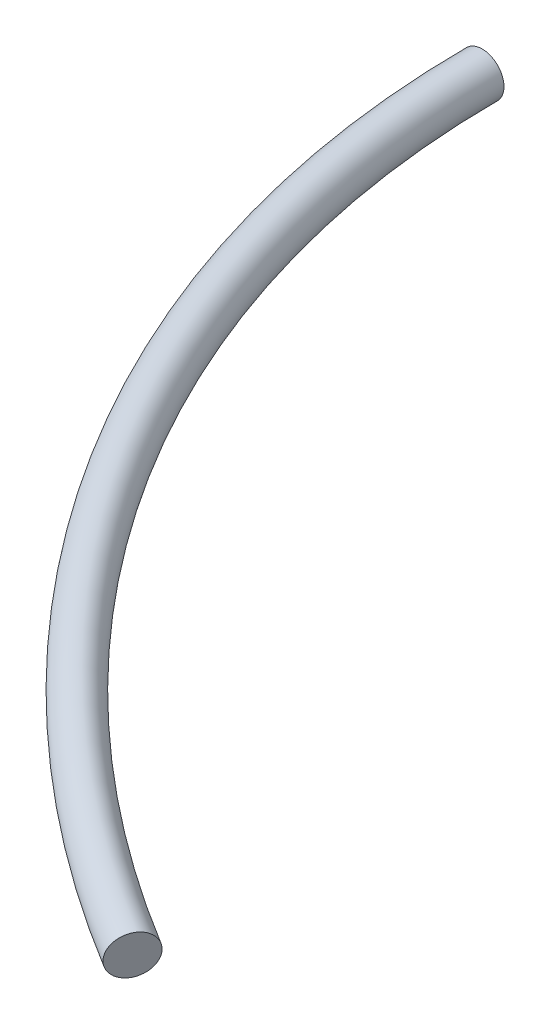
ISO-10303-21;
HEADER;
FILE_DESCRIPTION(('STEP AP214'),'2;1');
FILE_NAME('part.step','',(''),(''),'','','');
FILE_SCHEMA(('AUTOMOTIVE_DESIGN { 1 0 10303 214 1 1 1 1 }'));
ENDSEC;
DATA;
#1=APPLICATION_CONTEXT('core data for automotive mechanical design processes');
#2=APPLICATION_PROTOCOL_DEFINITION('international standard','automotive_design',2000,#1);
#3=PRODUCT_CONTEXT('',#1,'mechanical');
#4=PRODUCT('Part','Part','',(#3));
#5=PRODUCT_RELATED_PRODUCT_CATEGORY('part','',(#4));
#6=PRODUCT_DEFINITION_FORMATION('','',#4);
#7=PRODUCT_DEFINITION_CONTEXT('part definition',#1,'design');
#8=PRODUCT_DEFINITION('design','',#6,#7);
#9=PRODUCT_DEFINITION_SHAPE('','',#8);
#10=(LENGTH_UNIT() NAMED_UNIT(*) SI_UNIT(.MILLI.,.METRE.));
#11=(NAMED_UNIT(*) PLANE_ANGLE_UNIT() SI_UNIT($,.RADIAN.));
#12=(NAMED_UNIT(*) SI_UNIT($,.STERADIAN.) SOLID_ANGLE_UNIT());
#13=UNCERTAINTY_MEASURE_WITH_UNIT(LENGTH_MEASURE(1.E-05),#10,'distance_accuracy_value','');
#14=(GEOMETRIC_REPRESENTATION_CONTEXT(3) GLOBAL_UNCERTAINTY_ASSIGNED_CONTEXT((#13)) GLOBAL_UNIT_ASSIGNED_CONTEXT((#10,
#11,#12)) REPRESENTATION_CONTEXT('',''));
#15=CARTESIAN_POINT('',(0.,0.,0.));
#16=DIRECTION('',(0.,0.,1.));
#17=DIRECTION('',(1.,0.,0.));
#18=AXIS2_PLACEMENT_3D('',#15,#16,#17);
#19=CARTESIAN_POINT('',(4357.08669189762,-12312.8093709594,-1.4210854715202E-11));
#20=DIRECTION('',(-0.162560376745405,-0.986698598312774,0.));
#21=DIRECTION('',(0.986698598312774,-0.162560376745404,0.));
#22=AXIS2_PLACEMENT_3D('',#19,#20,#21);
#23=TOROIDAL_SURFACE('',#22,2259.74409013945,50.7999999999995);
#24=CARTESIAN_POINT('',(3304.32472029971,-12139.3649341083,1991.9971414143));
#25=DIRECTION('',(0.86978910393135,-0.143299326325089,0.4721569842299));
#26=DIRECTION('',(0.486105698358351,0.0846650146509059,-0.869789103931351));
#27=AXIS2_PLACEMENT_3D('',#24,#25,#26);
#28=CIRCLE('',#27,50.7999999999995);
#29=CARTESIAN_POINT('',(3280.65818726593,-12135.4658300325,2036.7780771076));
#30=VERTEX_POINT('',#29);
#31=EDGE_CURVE('E10',#30,#30,#28,.T.);
#32=CARTESIAN_POINT('',(2127.40036561146,-11945.4645203182,0.));
#33=DIRECTION('',(0.,0.,1.));
#34=DIRECTION('',(1.,0.,0.));
#35=AXIS2_PLACEMENT_3D('',#32,#33,#34);
#36=CIRCLE('',#35,50.7999999999995);
#37=CARTESIAN_POINT('',(2077.27607681717,-11937.2064531795,3.19466006209446E-13));
#38=VERTEX_POINT('',#37);
#39=EDGE_CURVE('E41',#38,#38,#36,.T.);
#40=CARTESIAN_POINT('',(4357.08669189762,-12312.8093709594,-1.4210854715202E-11));
#41=DIRECTION('',(-0.162560376745405,-0.986698598312774,0.));
#42=DIRECTION('',(0.986698598312774,-0.162560376745404,0.));
#43=AXIS2_PLACEMENT_3D('',#40,#41,#42);
#44=CIRCLE('',#43,2310.54409013944);
#45=EDGE_CURVE('',#30,#38,#44,.T.);
#46=ORIENTED_EDGE('',*,*,#31,.F.);
#47=ORIENTED_EDGE('',*,*,#39,.T.);
#48=ORIENTED_EDGE('',*,*,#45,.T.);
#49=ORIENTED_EDGE('',*,*,#45,.F.);
#50=EDGE_LOOP('',(#46,#48,#47,#49));
#51=FACE_BOUND('',#50,.T.);
#52=ADVANCED_FACE('F35',(#51),#23,.T.);
#53=CARTESIAN_POINT('',(3304.32472029971,-12139.3649341083,1991.9971414143));
#54=DIRECTION('',(0.86978910393135,-0.143299326325089,0.4721569842299));
#55=DIRECTION('',(0.486105698358351,0.0846650146509059,-0.869789103931351));
#56=AXIS2_PLACEMENT_3D('',#53,#54,#55);
#57=PLANE('',#56);
#58=ORIENTED_EDGE('',*,*,#31,.T.);
#59=EDGE_LOOP('',(#58));
#60=FACE_BOUND('',#59,.T.);
#61=ADVANCED_FACE('F50',(#60),#57,.T.);
#62=CARTESIAN_POINT('',(2127.40036561146,-11945.4645203182,0.));
#63=DIRECTION('',(0.,0.,1.));
#64=DIRECTION('',(1.,0.,0.));
#65=AXIS2_PLACEMENT_3D('',#62,#63,#64);
#66=PLANE('',#65);
#67=ORIENTED_EDGE('',*,*,#39,.F.);
#68=EDGE_LOOP('',(#67));
#69=FACE_BOUND('',#68,.T.);
#70=ADVANCED_FACE('F48',(#69),#66,.F.);
#71=CLOSED_SHELL('',(#52,#61,#70));
#72=MANIFOLD_SOLID_BREP('B2',#71);
#73=ADVANCED_BREP_SHAPE_REPRESENTATION('',(#18,#72),#14);
#74=SHAPE_DEFINITION_REPRESENTATION(#9,#73);
ENDSEC;
END-ISO-10303-21;
